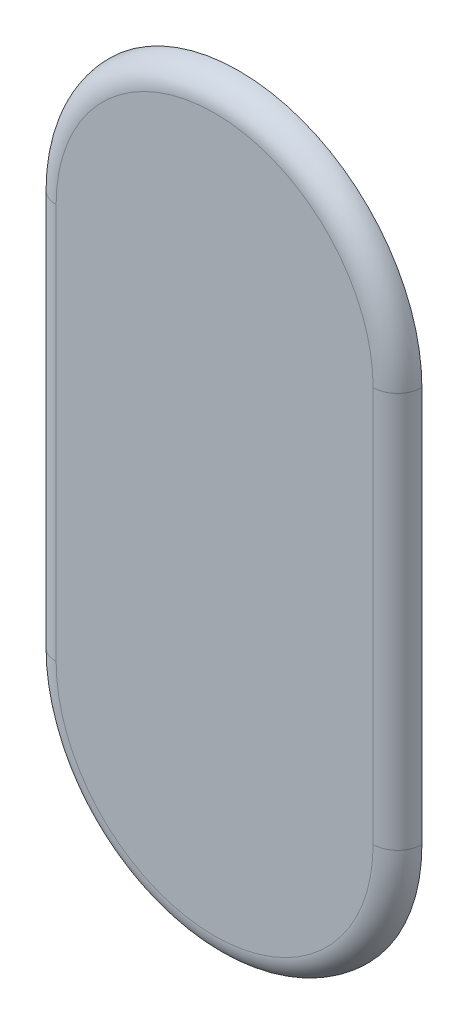
ISO-10303-21;
HEADER;
FILE_DESCRIPTION(('STEP AP214'),'2;1');
FILE_NAME('part.step','',(''),(''),'','','');
FILE_SCHEMA(('AUTOMOTIVE_DESIGN { 1 0 10303 214 1 1 1 1 }'));
ENDSEC;
DATA;
#1=APPLICATION_CONTEXT('core data for automotive mechanical design processes');
#2=APPLICATION_PROTOCOL_DEFINITION('international standard','automotive_design',2000,#1);
#3=PRODUCT_CONTEXT('',#1,'mechanical');
#4=PRODUCT('Part','Part','',(#3));
#5=PRODUCT_RELATED_PRODUCT_CATEGORY('part','',(#4));
#6=PRODUCT_DEFINITION_FORMATION('','',#4);
#7=PRODUCT_DEFINITION_CONTEXT('part definition',#1,'design');
#8=PRODUCT_DEFINITION('design','',#6,#7);
#9=PRODUCT_DEFINITION_SHAPE('','',#8);
#10=(LENGTH_UNIT() NAMED_UNIT(*) SI_UNIT(.MILLI.,.METRE.));
#11=(NAMED_UNIT(*) PLANE_ANGLE_UNIT() SI_UNIT($,.RADIAN.));
#12=(NAMED_UNIT(*) SI_UNIT($,.STERADIAN.) SOLID_ANGLE_UNIT());
#13=UNCERTAINTY_MEASURE_WITH_UNIT(LENGTH_MEASURE(1.E-05),#10,'distance_accuracy_value','');
#14=(GEOMETRIC_REPRESENTATION_CONTEXT(3) GLOBAL_UNCERTAINTY_ASSIGNED_CONTEXT((#13)) GLOBAL_UNIT_ASSIGNED_CONTEXT((#10,
#11,#12)) REPRESENTATION_CONTEXT('',''));
#15=CARTESIAN_POINT('',(0.,0.,0.));
#16=DIRECTION('',(0.,0.,1.));
#17=DIRECTION('',(1.,0.,0.));
#18=AXIS2_PLACEMENT_3D('',#15,#16,#17);
#19=CARTESIAN_POINT('',(0.,0.,10.));
#20=DIRECTION('',(0.,0.,1.));
#21=DIRECTION('',(1.,0.,0.));
#22=AXIS2_PLACEMENT_3D('',#19,#20,#21);
#23=PLANE('',#22);
#24=DIRECTION('',(0.,-1.,0.));
#25=VECTOR('',#24,1.);
#26=CARTESIAN_POINT('',(65.,0.,10.));
#27=LINE('',#26,#25);
#28=CARTESIAN_POINT('',(65.,-162.276597368695,10.));
#29=VERTEX_POINT('',#28);
#30=CARTESIAN_POINT('',(65.,0.,10.));
#31=VERTEX_POINT('',#30);
#32=EDGE_CURVE('E42',#29,#31,#27,.F.);
#33=ORIENTED_EDGE('',*,*,#32,.T.);
#34=CARTESIAN_POINT('',(0.,0.,10.));
#35=DIRECTION('',(0.,0.,1.));
#36=DIRECTION('',(1.,0.,0.));
#37=AXIS2_PLACEMENT_3D('',#34,#35,#36);
#38=CIRCLE('',#37,65.);
#39=CARTESIAN_POINT('',(-65.,0.,10.));
#40=VERTEX_POINT('',#39);
#41=EDGE_CURVE('E11',#31,#40,#38,.T.);
#42=ORIENTED_EDGE('',*,*,#41,.T.);
#43=DIRECTION('',(0.,-1.,0.));
#44=VECTOR('',#43,1.);
#45=CARTESIAN_POINT('',(-65.,-162.276597368695,10.));
#46=LINE('',#45,#44);
#47=CARTESIAN_POINT('',(-65.,-162.276597368695,10.));
#48=VERTEX_POINT('',#47);
#49=EDGE_CURVE('E98',#40,#48,#46,.T.);
#50=ORIENTED_EDGE('',*,*,#49,.T.);
#51=CARTESIAN_POINT('',(0.,-162.276597368695,10.));
#52=DIRECTION('',(0.,0.,1.));
#53=DIRECTION('',(1.,0.,0.));
#54=AXIS2_PLACEMENT_3D('',#51,#52,#53);
#55=CIRCLE('',#54,65.);
#56=EDGE_CURVE('E53',#48,#29,#55,.T.);
#57=ORIENTED_EDGE('',*,*,#56,.T.);
#58=EDGE_LOOP('',(#33,#42,#50,#57));
#59=FACE_BOUND('',#58,.T.);
#60=ADVANCED_FACE('F33',(#59),#23,.T.);
#61=CARTESIAN_POINT('',(0.,0.,0.));
#62=DIRECTION('',(0.,0.,1.));
#63=DIRECTION('',(1.,0.,0.));
#64=AXIS2_PLACEMENT_3D('',#61,#62,#63);
#65=PLANE('',#64);
#66=DIRECTION('',(0.,-1.,0.));
#67=VECTOR('',#66,1.);
#68=CARTESIAN_POINT('',(-75.,0.,0.));
#69=LINE('',#68,#67);
#70=CARTESIAN_POINT('',(-75.,0.,0.));
#71=VERTEX_POINT('',#70);
#72=CARTESIAN_POINT('',(-75.,-162.276597368695,0.));
#73=VERTEX_POINT('',#72);
#74=EDGE_CURVE('E78',#71,#73,#69,.T.);
#75=ORIENTED_EDGE('',*,*,#74,.F.);
#76=CARTESIAN_POINT('',(0.,0.,0.));
#77=DIRECTION('',(0.,0.,1.));
#78=DIRECTION('',(1.,0.,0.));
#79=AXIS2_PLACEMENT_3D('',#76,#77,#78);
#80=CIRCLE('',#79,75.);
#81=CARTESIAN_POINT('',(75.,0.,0.));
#82=VERTEX_POINT('',#81);
#83=EDGE_CURVE('E96',#82,#71,#80,.T.);
#84=ORIENTED_EDGE('',*,*,#83,.F.);
#85=DIRECTION('',(0.,-1.,0.));
#86=VECTOR('',#85,1.);
#87=CARTESIAN_POINT('',(75.,0.,0.));
#88=LINE('',#87,#86);
#89=CARTESIAN_POINT('',(75.,-162.276597368695,0.));
#90=VERTEX_POINT('',#89);
#91=EDGE_CURVE('E81',#82,#90,#88,.T.);
#92=ORIENTED_EDGE('',*,*,#91,.T.);
#93=CARTESIAN_POINT('',(0.,-162.276597368695,0.));
#94=DIRECTION('',(0.,0.,1.));
#95=DIRECTION('',(1.,0.,0.));
#96=AXIS2_PLACEMENT_3D('',#93,#94,#95);
#97=CIRCLE('',#96,75.);
#98=EDGE_CURVE('E73',#73,#90,#97,.T.);
#99=ORIENTED_EDGE('',*,*,#98,.F.);
#100=EDGE_LOOP('',(#75,#84,#92,#99));
#101=FACE_BOUND('',#100,.T.);
#102=ADVANCED_FACE('F75',(#101),#65,.F.);
#103=CARTESIAN_POINT('',(0.,-162.276597368695,0.));
#104=DIRECTION('',(0.,0.,1.));
#105=DIRECTION('',(1.,0.,0.));
#106=AXIS2_PLACEMENT_3D('',#103,#104,#105);
#107=TOROIDAL_SURFACE('',#106,65.,10.);
#108=CARTESIAN_POINT('',(-65.,-162.276597368695,0.));
#109=DIRECTION('',(0.,1.,0.));
#110=DIRECTION('',(0.,0.,1.));
#111=AXIS2_PLACEMENT_3D('',#108,#109,#110);
#112=CIRCLE('',#111,10.);
#113=EDGE_CURVE('E86',#73,#48,#112,.T.);
#114=ORIENTED_EDGE('',*,*,#113,.F.);
#115=ORIENTED_EDGE('',*,*,#98,.T.);
#116=CARTESIAN_POINT('',(65.,-162.276597368695,0.));
#117=DIRECTION('',(0.,1.,0.));
#118=DIRECTION('',(0.,0.,1.));
#119=AXIS2_PLACEMENT_3D('',#116,#117,#118);
#120=CIRCLE('',#119,10.);
#121=EDGE_CURVE('E37',#29,#90,#120,.T.);
#122=ORIENTED_EDGE('',*,*,#121,.F.);
#123=ORIENTED_EDGE('',*,*,#56,.F.);
#124=EDGE_LOOP('',(#114,#115,#122,#123));
#125=FACE_BOUND('',#124,.T.);
#126=ADVANCED_FACE('F35',(#125),#107,.T.);
#127=CARTESIAN_POINT('',(65.,0.,0.));
#128=DIRECTION('',(0.,-1.,0.));
#129=DIRECTION('',(0.,0.,-1.));
#130=AXIS2_PLACEMENT_3D('',#127,#128,#129);
#131=CYLINDRICAL_SURFACE('',#130,10.);
#132=ORIENTED_EDGE('',*,*,#121,.T.);
#133=ORIENTED_EDGE('',*,*,#91,.F.);
#134=CARTESIAN_POINT('',(65.,0.,0.));
#135=DIRECTION('',(0.,1.,0.));
#136=DIRECTION('',(0.,0.,1.));
#137=AXIS2_PLACEMENT_3D('',#134,#135,#136);
#138=CIRCLE('',#137,10.);
#139=EDGE_CURVE('E89',#31,#82,#138,.T.);
#140=ORIENTED_EDGE('',*,*,#139,.F.);
#141=ORIENTED_EDGE('',*,*,#32,.F.);
#142=EDGE_LOOP('',(#132,#133,#140,#141));
#143=FACE_BOUND('',#142,.T.);
#144=ADVANCED_FACE('F107',(#143),#131,.T.);
#145=CARTESIAN_POINT('',(-65.,0.,0.));
#146=DIRECTION('',(0.,1.,0.));
#147=DIRECTION('',(0.,0.,1.));
#148=AXIS2_PLACEMENT_3D('',#145,#146,#147);
#149=CYLINDRICAL_SURFACE('',#148,10.);
#150=ORIENTED_EDGE('',*,*,#113,.T.);
#151=ORIENTED_EDGE('',*,*,#49,.F.);
#152=CARTESIAN_POINT('',(-65.,0.,0.));
#153=DIRECTION('',(0.,1.,0.));
#154=DIRECTION('',(0.,0.,1.));
#155=AXIS2_PLACEMENT_3D('',#152,#153,#154);
#156=CIRCLE('',#155,10.);
#157=EDGE_CURVE('E92',#71,#40,#156,.T.);
#158=ORIENTED_EDGE('',*,*,#157,.F.);
#159=ORIENTED_EDGE('',*,*,#74,.T.);
#160=EDGE_LOOP('',(#150,#151,#158,#159));
#161=FACE_BOUND('',#160,.T.);
#162=ADVANCED_FACE('F91',(#161),#149,.T.);
#163=CARTESIAN_POINT('',(0.,0.,0.));
#164=DIRECTION('',(0.,0.,1.));
#165=DIRECTION('',(1.,0.,0.));
#166=AXIS2_PLACEMENT_3D('',#163,#164,#165);
#167=TOROIDAL_SURFACE('',#166,65.,10.);
#168=ORIENTED_EDGE('',*,*,#139,.T.);
#169=ORIENTED_EDGE('',*,*,#83,.T.);
#170=ORIENTED_EDGE('',*,*,#157,.T.);
#171=ORIENTED_EDGE('',*,*,#41,.F.);
#172=EDGE_LOOP('',(#168,#169,#170,#171));
#173=FACE_BOUND('',#172,.T.);
#174=ADVANCED_FACE('F105',(#173),#167,.T.);
#175=CLOSED_SHELL('',(#60,#102,#126,#144,#162,#174));
#176=MANIFOLD_SOLID_BREP('B2',#175);
#177=ADVANCED_BREP_SHAPE_REPRESENTATION('',(#18,#176),#14);
#178=SHAPE_DEFINITION_REPRESENTATION(#9,#177);
ENDSEC;
END-ISO-10303-21;
